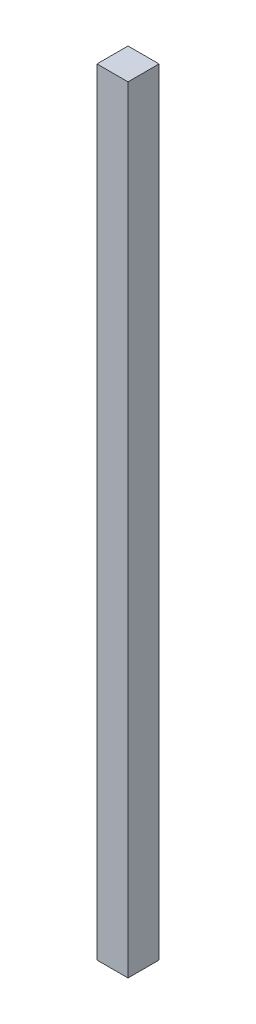
ISO-10303-21;
HEADER;
FILE_DESCRIPTION(('STEP AP214'),'2;1');
FILE_NAME('part.step','',(''),(''),'','','');
FILE_SCHEMA(('AUTOMOTIVE_DESIGN { 1 0 10303 214 1 1 1 1 }'));
ENDSEC;
DATA;
#1=APPLICATION_CONTEXT('core data for automotive mechanical design processes');
#2=APPLICATION_PROTOCOL_DEFINITION('international standard','automotive_design',2000,#1);
#3=PRODUCT_CONTEXT('',#1,'mechanical');
#4=PRODUCT('Part','Part','',(#3));
#5=PRODUCT_RELATED_PRODUCT_CATEGORY('part','',(#4));
#6=PRODUCT_DEFINITION_FORMATION('','',#4);
#7=PRODUCT_DEFINITION_CONTEXT('part definition',#1,'design');
#8=PRODUCT_DEFINITION('design','',#6,#7);
#9=PRODUCT_DEFINITION_SHAPE('','',#8);
#10=(LENGTH_UNIT() NAMED_UNIT(*) SI_UNIT(.MILLI.,.METRE.));
#11=(NAMED_UNIT(*) PLANE_ANGLE_UNIT() SI_UNIT($,.RADIAN.));
#12=(NAMED_UNIT(*) SI_UNIT($,.STERADIAN.) SOLID_ANGLE_UNIT());
#13=UNCERTAINTY_MEASURE_WITH_UNIT(LENGTH_MEASURE(1.E-05),#10,'distance_accuracy_value','');
#14=(GEOMETRIC_REPRESENTATION_CONTEXT(3) GLOBAL_UNCERTAINTY_ASSIGNED_CONTEXT((#13)) GLOBAL_UNIT_ASSIGNED_CONTEXT((#10,
#11,#12)) REPRESENTATION_CONTEXT('',''));
#15=CARTESIAN_POINT('',(0.,0.,0.));
#16=DIRECTION('',(0.,0.,1.));
#17=DIRECTION('',(1.,0.,0.));
#18=AXIS2_PLACEMENT_3D('',#15,#16,#17);
#19=CARTESIAN_POINT('',(10.,500.,-10.));
#20=DIRECTION('',(-1.,0.,0.));
#21=DIRECTION('',(0.,0.,1.));
#22=AXIS2_PLACEMENT_3D('',#19,#20,#21);
#23=PLANE('',#22);
#24=DIRECTION('',(0.,0.,-1.));
#25=VECTOR('',#24,1.);
#26=CARTESIAN_POINT('',(10.,0.,-10.));
#27=LINE('',#26,#25);
#28=CARTESIAN_POINT('',(10.,0.,9.99999999999999));
#29=VERTEX_POINT('',#28);
#30=CARTESIAN_POINT('',(10.,0.,-10.));
#31=VERTEX_POINT('',#30);
#32=EDGE_CURVE('E96',#29,#31,#27,.T.);
#33=ORIENTED_EDGE('',*,*,#32,.T.);
#34=DIRECTION('',(0.,-1.,0.));
#35=VECTOR('',#34,1.);
#36=CARTESIAN_POINT('',(10.,500.,-10.));
#37=LINE('',#36,#35);
#38=CARTESIAN_POINT('',(10.,500.,-10.));
#39=VERTEX_POINT('',#38);
#40=EDGE_CURVE('E11',#39,#31,#37,.T.);
#41=ORIENTED_EDGE('',*,*,#40,.F.);
#42=DIRECTION('',(0.,0.,-1.));
#43=VECTOR('',#42,1.);
#44=CARTESIAN_POINT('',(10.,500.,-10.));
#45=LINE('',#44,#43);
#46=CARTESIAN_POINT('',(10.,500.,9.99999999999999));
#47=VERTEX_POINT('',#46);
#48=EDGE_CURVE('E84',#47,#39,#45,.T.);
#49=ORIENTED_EDGE('',*,*,#48,.F.);
#50=DIRECTION('',(0.,-1.,0.));
#51=VECTOR('',#50,1.);
#52=CARTESIAN_POINT('',(10.,500.,9.99999999999999));
#53=LINE('',#52,#51);
#54=EDGE_CURVE('E92',#47,#29,#53,.T.);
#55=ORIENTED_EDGE('',*,*,#54,.T.);
#56=EDGE_LOOP('',(#33,#41,#49,#55));
#57=FACE_BOUND('',#56,.T.);
#58=ADVANCED_FACE('F33',(#57),#23,.F.);
#59=CARTESIAN_POINT('',(-10.,500.,-10.));
#60=DIRECTION('',(0.,0.,1.));
#61=DIRECTION('',(1.,0.,0.));
#62=AXIS2_PLACEMENT_3D('',#59,#60,#61);
#63=PLANE('',#62);
#64=DIRECTION('',(-1.,0.,0.));
#65=VECTOR('',#64,1.);
#66=CARTESIAN_POINT('',(-10.,0.,-10.));
#67=LINE('',#66,#65);
#68=CARTESIAN_POINT('',(-10.,0.,-10.));
#69=VERTEX_POINT('',#68);
#70=EDGE_CURVE('E88',#31,#69,#67,.T.);
#71=ORIENTED_EDGE('',*,*,#70,.T.);
#72=DIRECTION('',(0.,-1.,0.));
#73=VECTOR('',#72,1.);
#74=CARTESIAN_POINT('',(-10.,500.,-10.));
#75=LINE('',#74,#73);
#76=CARTESIAN_POINT('',(-10.,500.,-10.));
#77=VERTEX_POINT('',#76);
#78=EDGE_CURVE('E41',#77,#69,#75,.T.);
#79=ORIENTED_EDGE('',*,*,#78,.F.);
#80=DIRECTION('',(-1.,0.,0.));
#81=VECTOR('',#80,1.);
#82=CARTESIAN_POINT('',(-10.,500.,-10.));
#83=LINE('',#82,#81);
#84=EDGE_CURVE('E79',#39,#77,#83,.T.);
#85=ORIENTED_EDGE('',*,*,#84,.F.);
#86=ORIENTED_EDGE('',*,*,#40,.T.);
#87=EDGE_LOOP('',(#71,#79,#85,#86));
#88=FACE_BOUND('',#87,.T.);
#89=ADVANCED_FACE('F87',(#88),#63,.F.);
#90=CARTESIAN_POINT('',(-10.,500.,-10.));
#91=DIRECTION('',(1.,0.,0.));
#92=DIRECTION('',(0.,0.,-1.));
#93=AXIS2_PLACEMENT_3D('',#90,#91,#92);
#94=PLANE('',#93);
#95=DIRECTION('',(0.,0.,1.));
#96=VECTOR('',#95,1.);
#97=CARTESIAN_POINT('',(-10.,0.,-10.));
#98=LINE('',#97,#96);
#99=CARTESIAN_POINT('',(-10.,0.,9.99999999999999));
#100=VERTEX_POINT('',#99);
#101=EDGE_CURVE('E66',#69,#100,#98,.T.);
#102=ORIENTED_EDGE('',*,*,#101,.T.);
#103=DIRECTION('',(0.,-1.,0.));
#104=VECTOR('',#103,1.);
#105=CARTESIAN_POINT('',(-10.,500.,9.99999999999999));
#106=LINE('',#105,#104);
#107=CARTESIAN_POINT('',(-10.,500.,9.99999999999999));
#108=VERTEX_POINT('',#107);
#109=EDGE_CURVE('E89',#108,#100,#106,.T.);
#110=ORIENTED_EDGE('',*,*,#109,.F.);
#111=DIRECTION('',(0.,0.,1.));
#112=VECTOR('',#111,1.);
#113=CARTESIAN_POINT('',(-10.,500.,-10.));
#114=LINE('',#113,#112);
#115=EDGE_CURVE('E82',#77,#108,#114,.T.);
#116=ORIENTED_EDGE('',*,*,#115,.F.);
#117=ORIENTED_EDGE('',*,*,#78,.T.);
#118=EDGE_LOOP('',(#102,#110,#116,#117));
#119=FACE_BOUND('',#118,.T.);
#120=ADVANCED_FACE('F90',(#119),#94,.F.);
#121=CARTESIAN_POINT('',(-10.,500.,9.99999999999999));
#122=DIRECTION('',(0.,0.,-1.));
#123=DIRECTION('',(-1.,0.,0.));
#124=AXIS2_PLACEMENT_3D('',#121,#122,#123);
#125=PLANE('',#124);
#126=DIRECTION('',(1.,0.,0.));
#127=VECTOR('',#126,1.);
#128=CARTESIAN_POINT('',(-10.,0.,9.99999999999999));
#129=LINE('',#128,#127);
#130=EDGE_CURVE('E72',#100,#29,#129,.T.);
#131=ORIENTED_EDGE('',*,*,#130,.T.);
#132=ORIENTED_EDGE('',*,*,#54,.F.);
#133=DIRECTION('',(1.,0.,0.));
#134=VECTOR('',#133,1.);
#135=CARTESIAN_POINT('',(-10.,500.,9.99999999999999));
#136=LINE('',#135,#134);
#137=EDGE_CURVE('E49',#108,#47,#136,.T.);
#138=ORIENTED_EDGE('',*,*,#137,.F.);
#139=ORIENTED_EDGE('',*,*,#109,.T.);
#140=EDGE_LOOP('',(#131,#132,#138,#139));
#141=FACE_BOUND('',#140,.T.);
#142=ADVANCED_FACE('F103',(#141),#125,.F.);
#143=CARTESIAN_POINT('',(0.,500.,0.));
#144=DIRECTION('',(0.,1.,0.));
#145=DIRECTION('',(0.,0.,1.));
#146=AXIS2_PLACEMENT_3D('',#143,#144,#145);
#147=PLANE('',#146);
#148=ORIENTED_EDGE('',*,*,#48,.T.);
#149=ORIENTED_EDGE('',*,*,#84,.T.);
#150=ORIENTED_EDGE('',*,*,#115,.T.);
#151=ORIENTED_EDGE('',*,*,#137,.T.);
#152=EDGE_LOOP('',(#148,#149,#150,#151));
#153=FACE_BOUND('',#152,.T.);
#154=ADVANCED_FACE('F80',(#153),#147,.T.);
#155=CARTESIAN_POINT('',(0.,0.,0.));
#156=DIRECTION('',(0.,1.,0.));
#157=DIRECTION('',(0.,0.,1.));
#158=AXIS2_PLACEMENT_3D('',#155,#156,#157);
#159=PLANE('',#158);
#160=ORIENTED_EDGE('',*,*,#32,.F.);
#161=ORIENTED_EDGE('',*,*,#130,.F.);
#162=ORIENTED_EDGE('',*,*,#101,.F.);
#163=ORIENTED_EDGE('',*,*,#70,.F.);
#164=EDGE_LOOP('',(#160,#161,#162,#163));
#165=FACE_BOUND('',#164,.T.);
#166=ADVANCED_FACE('F106',(#165),#159,.F.);
#167=CLOSED_SHELL('',(#58,#89,#120,#142,#154,#166));
#168=MANIFOLD_SOLID_BREP('B2',#167);
#169=ADVANCED_BREP_SHAPE_REPRESENTATION('',(#18,#168),#14);
#170=SHAPE_DEFINITION_REPRESENTATION(#9,#169);
ENDSEC;
END-ISO-10303-21;
